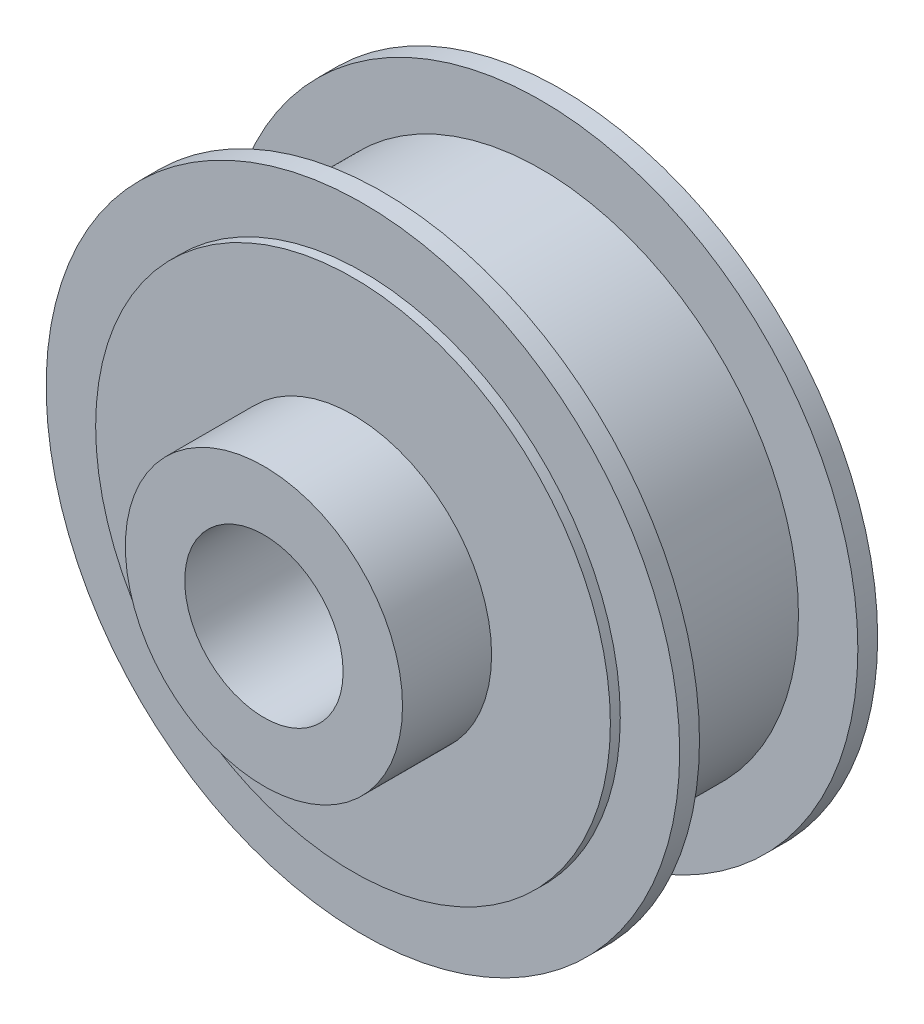
ISO-10303-21;
HEADER;
FILE_DESCRIPTION(('STEP AP214'),'2;1');
FILE_NAME('part.step','',(''),(''),'','','');
FILE_SCHEMA(('AUTOMOTIVE_DESIGN { 1 0 10303 214 1 1 1 1 }'));
ENDSEC;
DATA;
#1=APPLICATION_CONTEXT('core data for automotive mechanical design processes');
#2=APPLICATION_PROTOCOL_DEFINITION('international standard','automotive_design',2000,#1);
#3=PRODUCT_CONTEXT('',#1,'mechanical');
#4=PRODUCT('Part','Part','',(#3));
#5=PRODUCT_RELATED_PRODUCT_CATEGORY('part','',(#4));
#6=PRODUCT_DEFINITION_FORMATION('','',#4);
#7=PRODUCT_DEFINITION_CONTEXT('part definition',#1,'design');
#8=PRODUCT_DEFINITION('design','',#6,#7);
#9=PRODUCT_DEFINITION_SHAPE('','',#8);
#10=(LENGTH_UNIT() NAMED_UNIT(*) SI_UNIT(.MILLI.,.METRE.));
#11=(NAMED_UNIT(*) PLANE_ANGLE_UNIT() SI_UNIT($,.RADIAN.));
#12=(NAMED_UNIT(*) SI_UNIT($,.STERADIAN.) SOLID_ANGLE_UNIT());
#13=UNCERTAINTY_MEASURE_WITH_UNIT(LENGTH_MEASURE(1.E-05),#10,'distance_accuracy_value','');
#14=(GEOMETRIC_REPRESENTATION_CONTEXT(3) GLOBAL_UNCERTAINTY_ASSIGNED_CONTEXT((#13)) GLOBAL_UNIT_ASSIGNED_CONTEXT((#10,
#11,#12)) REPRESENTATION_CONTEXT('',''));
#15=CARTESIAN_POINT('',(0.,0.,0.));
#16=DIRECTION('',(0.,0.,1.));
#17=DIRECTION('',(1.,0.,0.));
#18=AXIS2_PLACEMENT_3D('',#15,#16,#17);
#19=CARTESIAN_POINT('',(0.,0.,1.));
#20=DIRECTION('',(0.,0.,-1.));
#21=DIRECTION('',(-1.,0.,0.));
#22=AXIS2_PLACEMENT_3D('',#19,#20,#21);
#23=CYLINDRICAL_SURFACE('',#22,16.);
#24=CARTESIAN_POINT('',(0.,0.,1.));
#25=DIRECTION('',(0.,0.,1.));
#26=DIRECTION('',(1.,0.,0.));
#27=AXIS2_PLACEMENT_3D('',#24,#25,#26);
#28=CIRCLE('',#27,16.);
#29=CARTESIAN_POINT('',(16.,0.,1.));
#30=VERTEX_POINT('',#29);
#31=EDGE_CURVE('E47',#30,#30,#28,.T.);
#32=ORIENTED_EDGE('',*,*,#31,.F.);
#33=EDGE_LOOP('',(#32));
#34=FACE_BOUND('',#33,.T.);
#35=CARTESIAN_POINT('',(0.,0.,0.));
#36=DIRECTION('',(0.,0.,1.));
#37=DIRECTION('',(1.,0.,0.));
#38=AXIS2_PLACEMENT_3D('',#35,#36,#37);
#39=CIRCLE('',#38,16.);
#40=CARTESIAN_POINT('',(16.,0.,0.));
#41=VERTEX_POINT('',#40);
#42=EDGE_CURVE('E71',#41,#41,#39,.T.);
#43=ORIENTED_EDGE('',*,*,#42,.T.);
#44=EDGE_LOOP('',(#43));
#45=FACE_BOUND('',#44,.T.);
#46=ADVANCED_FACE('F35',(#34,#45),#23,.T.);
#47=CARTESIAN_POINT('',(0.,0.,1.));
#48=DIRECTION('',(0.,0.,1.));
#49=DIRECTION('',(1.,0.,0.));
#50=AXIS2_PLACEMENT_3D('',#47,#48,#49);
#51=PLANE('',#50);
#52=CARTESIAN_POINT('',(0.,0.,1.));
#53=DIRECTION('',(0.,0.,1.));
#54=DIRECTION('',(1.,0.,0.));
#55=AXIS2_PLACEMENT_3D('',#52,#53,#54);
#56=CIRCLE('',#55,13.);
#57=CARTESIAN_POINT('',(13.,0.,1.));
#58=VERTEX_POINT('',#57);
#59=EDGE_CURVE('E42',#58,#58,#56,.T.);
#60=ORIENTED_EDGE('',*,*,#59,.F.);
#61=EDGE_LOOP('',(#60));
#62=FACE_BOUND('',#61,.T.);
#63=ORIENTED_EDGE('',*,*,#31,.T.);
#64=EDGE_LOOP('',(#63));
#65=FACE_BOUND('',#64,.T.);
#66=ADVANCED_FACE('F115',(#62,#65),#51,.T.);
#67=CARTESIAN_POINT('',(0.,0.,0.));
#68=DIRECTION('',(0.,0.,1.));
#69=DIRECTION('',(1.,0.,0.));
#70=AXIS2_PLACEMENT_3D('',#67,#68,#69);
#71=PLANE('',#70);
#72=CARTESIAN_POINT('',(0.,0.,0.));
#73=DIRECTION('',(0.,0.,-1.));
#74=DIRECTION('',(-1.,0.,0.));
#75=AXIS2_PLACEMENT_3D('',#72,#73,#74);
#76=CIRCLE('',#75,13.);
#77=CARTESIAN_POINT('',(-13.,0.,0.));
#78=VERTEX_POINT('',#77);
#79=EDGE_CURVE('E10',#78,#78,#76,.T.);
#80=ORIENTED_EDGE('',*,*,#79,.F.);
#81=EDGE_LOOP('',(#80));
#82=FACE_BOUND('',#81,.T.);
#83=ORIENTED_EDGE('',*,*,#42,.F.);
#84=EDGE_LOOP('',(#83));
#85=FACE_BOUND('',#84,.T.);
#86=ADVANCED_FACE('F120',(#82,#85),#71,.F.);
#87=CARTESIAN_POINT('',(0.,0.,9.));
#88=DIRECTION('',(0.,0.,-1.));
#89=DIRECTION('',(-1.,0.,0.));
#90=AXIS2_PLACEMENT_3D('',#87,#88,#89);
#91=CYLINDRICAL_SURFACE('',#90,13.);
#92=CARTESIAN_POINT('',(0.,0.,9.));
#93=DIRECTION('',(0.,0.,1.));
#94=DIRECTION('',(1.,0.,0.));
#95=AXIS2_PLACEMENT_3D('',#92,#93,#94);
#96=CIRCLE('',#95,13.);
#97=CARTESIAN_POINT('',(13.,0.,9.));
#98=VERTEX_POINT('',#97);
#99=EDGE_CURVE('E67',#98,#98,#96,.T.);
#100=ORIENTED_EDGE('',*,*,#99,.F.);
#101=EDGE_LOOP('',(#100));
#102=FACE_BOUND('',#101,.T.);
#103=ORIENTED_EDGE('',*,*,#59,.T.);
#104=EDGE_LOOP('',(#103));
#105=FACE_BOUND('',#104,.T.);
#106=ADVANCED_FACE('F105',(#102,#105),#91,.T.);
#107=CARTESIAN_POINT('',(0.,0.,10.));
#108=DIRECTION('',(0.,0.,-1.));
#109=DIRECTION('',(-1.,0.,0.));
#110=AXIS2_PLACEMENT_3D('',#107,#108,#109);
#111=CYLINDRICAL_SURFACE('',#110,16.);
#112=CARTESIAN_POINT('',(0.,0.,10.));
#113=DIRECTION('',(0.,0.,1.));
#114=DIRECTION('',(1.,0.,0.));
#115=AXIS2_PLACEMENT_3D('',#112,#113,#114);
#116=CIRCLE('',#115,16.);
#117=CARTESIAN_POINT('',(16.,0.,10.));
#118=VERTEX_POINT('',#117);
#119=EDGE_CURVE('E64',#118,#118,#116,.T.);
#120=ORIENTED_EDGE('',*,*,#119,.F.);
#121=EDGE_LOOP('',(#120));
#122=FACE_BOUND('',#121,.T.);
#123=CARTESIAN_POINT('',(0.,0.,9.));
#124=DIRECTION('',(0.,0.,1.));
#125=DIRECTION('',(1.,0.,0.));
#126=AXIS2_PLACEMENT_3D('',#123,#124,#125);
#127=CIRCLE('',#126,16.);
#128=CARTESIAN_POINT('',(16.,0.,9.));
#129=VERTEX_POINT('',#128);
#130=EDGE_CURVE('E63',#129,#129,#127,.T.);
#131=ORIENTED_EDGE('',*,*,#130,.T.);
#132=EDGE_LOOP('',(#131));
#133=FACE_BOUND('',#132,.T.);
#134=ADVANCED_FACE('F99',(#122,#133),#111,.T.);
#135=CARTESIAN_POINT('',(0.,0.,10.));
#136=DIRECTION('',(0.,0.,1.));
#137=DIRECTION('',(1.,0.,0.));
#138=AXIS2_PLACEMENT_3D('',#135,#136,#137);
#139=PLANE('',#138);
#140=CARTESIAN_POINT('',(0.,0.,10.));
#141=DIRECTION('',(0.,0.,1.));
#142=DIRECTION('',(1.,0.,0.));
#143=AXIS2_PLACEMENT_3D('',#140,#141,#142);
#144=CIRCLE('',#143,13.);
#145=CARTESIAN_POINT('',(13.,0.,10.));
#146=VERTEX_POINT('',#145);
#147=EDGE_CURVE('E57',#146,#146,#144,.T.);
#148=ORIENTED_EDGE('',*,*,#147,.F.);
#149=EDGE_LOOP('',(#148));
#150=FACE_BOUND('',#149,.T.);
#151=ORIENTED_EDGE('',*,*,#119,.T.);
#152=EDGE_LOOP('',(#151));
#153=FACE_BOUND('',#152,.T.);
#154=ADVANCED_FACE('F96',(#150,#153),#139,.T.);
#155=CARTESIAN_POINT('',(0.,0.,9.));
#156=DIRECTION('',(0.,0.,1.));
#157=DIRECTION('',(1.,0.,0.));
#158=AXIS2_PLACEMENT_3D('',#155,#156,#157);
#159=PLANE('',#158);
#160=ORIENTED_EDGE('',*,*,#99,.T.);
#161=EDGE_LOOP('',(#160));
#162=FACE_BOUND('',#161,.T.);
#163=ORIENTED_EDGE('',*,*,#130,.F.);
#164=EDGE_LOOP('',(#163));
#165=FACE_BOUND('',#164,.T.);
#166=ADVANCED_FACE('F92',(#162,#165),#159,.F.);
#167=CARTESIAN_POINT('',(0.,0.,10.5));
#168=DIRECTION('',(0.,0.,-1.));
#169=DIRECTION('',(-1.,0.,0.));
#170=AXIS2_PLACEMENT_3D('',#167,#168,#169);
#171=CYLINDRICAL_SURFACE('',#170,13.);
#172=CARTESIAN_POINT('',(0.,0.,10.5));
#173=DIRECTION('',(0.,0.,1.));
#174=DIRECTION('',(1.,0.,0.));
#175=AXIS2_PLACEMENT_3D('',#172,#173,#174);
#176=CIRCLE('',#175,13.);
#177=CARTESIAN_POINT('',(13.,0.,10.5));
#178=VERTEX_POINT('',#177);
#179=EDGE_CURVE('E53',#178,#178,#176,.T.);
#180=ORIENTED_EDGE('',*,*,#179,.F.);
#181=EDGE_LOOP('',(#180));
#182=FACE_BOUND('',#181,.T.);
#183=ORIENTED_EDGE('',*,*,#147,.T.);
#184=EDGE_LOOP('',(#183));
#185=FACE_BOUND('',#184,.T.);
#186=ADVANCED_FACE('F86',(#182,#185),#171,.T.);
#187=CARTESIAN_POINT('',(0.,0.,10.5));
#188=DIRECTION('',(0.,0.,1.));
#189=DIRECTION('',(1.,0.,0.));
#190=AXIS2_PLACEMENT_3D('',#187,#188,#189);
#191=PLANE('',#190);
#192=CARTESIAN_POINT('',(0.,0.,10.5));
#193=DIRECTION('',(0.,0.,1.));
#194=DIRECTION('',(1.,0.,0.));
#195=AXIS2_PLACEMENT_3D('',#192,#193,#194);
#196=CIRCLE('',#195,7.);
#197=CARTESIAN_POINT('',(7.,0.,10.5));
#198=VERTEX_POINT('',#197);
#199=EDGE_CURVE('E56',#198,#198,#196,.T.);
#200=ORIENTED_EDGE('',*,*,#199,.F.);
#201=EDGE_LOOP('',(#200));
#202=FACE_BOUND('',#201,.T.);
#203=ORIENTED_EDGE('',*,*,#179,.T.);
#204=EDGE_LOOP('',(#203));
#205=FACE_BOUND('',#204,.T.);
#206=ADVANCED_FACE('F82',(#202,#205),#191,.T.);
#207=CARTESIAN_POINT('',(0.,0.,15.));
#208=DIRECTION('',(0.,0.,1.));
#209=DIRECTION('',(1.,0.,0.));
#210=AXIS2_PLACEMENT_3D('',#207,#208,#209);
#211=PLANE('',#210);
#212=CARTESIAN_POINT('',(0.,0.,15.));
#213=DIRECTION('',(0.,0.,1.));
#214=DIRECTION('',(1.,0.,0.));
#215=AXIS2_PLACEMENT_3D('',#212,#213,#214);
#216=CIRCLE('',#215,4.);
#217=CARTESIAN_POINT('',(4.,0.,15.));
#218=VERTEX_POINT('',#217);
#219=EDGE_CURVE('E224',#218,#218,#216,.T.);
#220=ORIENTED_EDGE('',*,*,#219,.F.);
#221=EDGE_LOOP('',(#220));
#222=FACE_BOUND('',#221,.T.);
#223=CARTESIAN_POINT('',(0.,0.,15.));
#224=DIRECTION('',(0.,0.,1.));
#225=DIRECTION('',(1.,0.,0.));
#226=AXIS2_PLACEMENT_3D('',#223,#224,#225);
#227=CIRCLE('',#226,7.);
#228=CARTESIAN_POINT('',(7.,0.,15.));
#229=VERTEX_POINT('',#228);
#230=EDGE_CURVE('E60',#229,#229,#227,.T.);
#231=ORIENTED_EDGE('',*,*,#230,.T.);
#232=EDGE_LOOP('',(#231));
#233=FACE_BOUND('',#232,.T.);
#234=ADVANCED_FACE('F85',(#222,#233),#211,.T.);
#235=CARTESIAN_POINT('',(0.,0.,15.));
#236=DIRECTION('',(0.,0.,-1.));
#237=DIRECTION('',(-1.,0.,0.));
#238=AXIS2_PLACEMENT_3D('',#235,#236,#237);
#239=CYLINDRICAL_SURFACE('',#238,7.);
#240=ORIENTED_EDGE('',*,*,#199,.T.);
#241=EDGE_LOOP('',(#240));
#242=FACE_BOUND('',#241,.T.);
#243=ORIENTED_EDGE('',*,*,#230,.F.);
#244=EDGE_LOOP('',(#243));
#245=FACE_BOUND('',#244,.T.);
#246=ADVANCED_FACE('F79',(#242,#245),#239,.T.);
#247=CARTESIAN_POINT('',(0.,0.,-0.5));
#248=DIRECTION('',(0.,0.,1.));
#249=DIRECTION('',(1.,0.,0.));
#250=AXIS2_PLACEMENT_3D('',#247,#248,#249);
#251=CYLINDRICAL_SURFACE('',#250,13.);
#252=CARTESIAN_POINT('',(0.,0.,-0.5));
#253=DIRECTION('',(0.,0.,-1.));
#254=DIRECTION('',(-1.,0.,0.));
#255=AXIS2_PLACEMENT_3D('',#252,#253,#254);
#256=CIRCLE('',#255,13.);
#257=CARTESIAN_POINT('',(-13.,0.,-0.5));
#258=VERTEX_POINT('',#257);
#259=EDGE_CURVE('E51',#258,#258,#256,.T.);
#260=ORIENTED_EDGE('',*,*,#259,.F.);
#261=EDGE_LOOP('',(#260));
#262=FACE_BOUND('',#261,.T.);
#263=ORIENTED_EDGE('',*,*,#79,.T.);
#264=EDGE_LOOP('',(#263));
#265=FACE_BOUND('',#264,.T.);
#266=ADVANCED_FACE('F174',(#262,#265),#251,.T.);
#267=CARTESIAN_POINT('',(0.,0.,-0.5));
#268=DIRECTION('',(0.,0.,-1.));
#269=DIRECTION('',(-1.,0.,0.));
#270=AXIS2_PLACEMENT_3D('',#267,#268,#269);
#271=PLANE('',#270);
#272=CARTESIAN_POINT('',(0.,0.,-0.5));
#273=DIRECTION('',(0.,0.,-1.));
#274=DIRECTION('',(-1.,0.,0.));
#275=AXIS2_PLACEMENT_3D('',#272,#273,#274);
#276=CIRCLE('',#275,4.);
#277=CARTESIAN_POINT('',(-4.,0.,-0.5));
#278=VERTEX_POINT('',#277);
#279=EDGE_CURVE('E38',#278,#278,#276,.T.);
#280=ORIENTED_EDGE('',*,*,#279,.F.);
#281=EDGE_LOOP('',(#280));
#282=FACE_BOUND('',#281,.T.);
#283=ORIENTED_EDGE('',*,*,#259,.T.);
#284=EDGE_LOOP('',(#283));
#285=FACE_BOUND('',#284,.T.);
#286=ADVANCED_FACE('F188',(#282,#285),#271,.T.);
#287=CARTESIAN_POINT('',(0.,0.,-0.999999999999997));
#288=DIRECTION('',(0.,0.,1.));
#289=DIRECTION('',(1.,0.,0.));
#290=AXIS2_PLACEMENT_3D('',#287,#288,#289);
#291=CYLINDRICAL_SURFACE('',#290,4.);
#292=ORIENTED_EDGE('',*,*,#279,.T.);
#293=EDGE_LOOP('',(#292));
#294=FACE_BOUND('',#293,.T.);
#295=ORIENTED_EDGE('',*,*,#219,.T.);
#296=EDGE_LOOP('',(#295));
#297=FACE_BOUND('',#296,.T.);
#298=ADVANCED_FACE('F205',(#294,#297),#291,.F.);
#299=CLOSED_SHELL('',(#46,#66,#86,#106,#134,#154,#166,#186,#206,#234,#246,#266,#286,#298));
#300=MANIFOLD_SOLID_BREP('B2',#299);
#301=ADVANCED_BREP_SHAPE_REPRESENTATION('',(#18,#300),#14);
#302=SHAPE_DEFINITION_REPRESENTATION(#9,#301);
ENDSEC;
END-ISO-10303-21;
